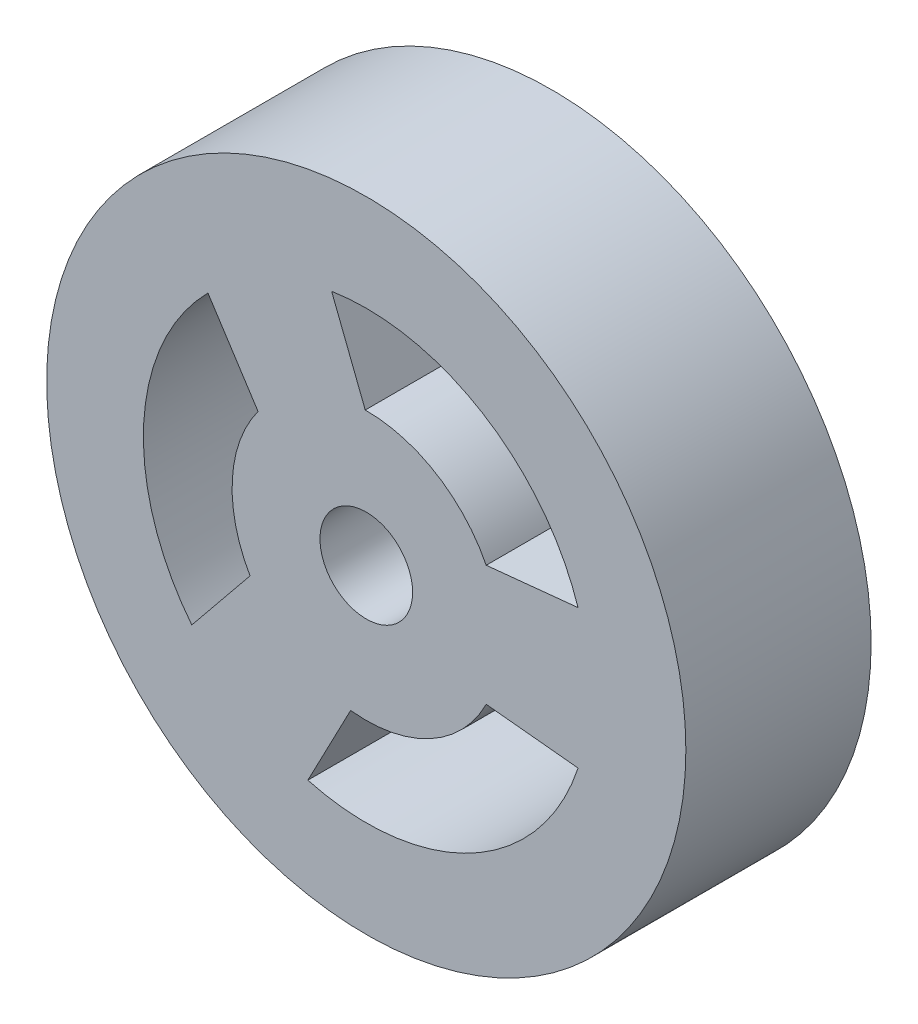
ISO-10303-21;
HEADER;
FILE_DESCRIPTION(('STEP AP214'),'2;1');
FILE_NAME('part.step','',(''),(''),'','','');
FILE_SCHEMA(('AUTOMOTIVE_DESIGN { 1 0 10303 214 1 1 1 1 }'));
ENDSEC;
DATA;
#1=APPLICATION_CONTEXT('core data for automotive mechanical design processes');
#2=APPLICATION_PROTOCOL_DEFINITION('international standard','automotive_design',2000,#1);
#3=PRODUCT_CONTEXT('',#1,'mechanical');
#4=PRODUCT('Part','Part','',(#3));
#5=PRODUCT_RELATED_PRODUCT_CATEGORY('part','',(#4));
#6=PRODUCT_DEFINITION_FORMATION('','',#4);
#7=PRODUCT_DEFINITION_CONTEXT('part definition',#1,'design');
#8=PRODUCT_DEFINITION('design','',#6,#7);
#9=PRODUCT_DEFINITION_SHAPE('','',#8);
#10=(LENGTH_UNIT() NAMED_UNIT(*) SI_UNIT(.MILLI.,.METRE.));
#11=(NAMED_UNIT(*) PLANE_ANGLE_UNIT() SI_UNIT($,.RADIAN.));
#12=(NAMED_UNIT(*) SI_UNIT($,.STERADIAN.) SOLID_ANGLE_UNIT());
#13=UNCERTAINTY_MEASURE_WITH_UNIT(LENGTH_MEASURE(1.E-05),#10,'distance_accuracy_value','');
#14=(GEOMETRIC_REPRESENTATION_CONTEXT(3) GLOBAL_UNCERTAINTY_ASSIGNED_CONTEXT((#13)) GLOBAL_UNIT_ASSIGNED_CONTEXT((#10,
#11,#12)) REPRESENTATION_CONTEXT('',''));
#15=CARTESIAN_POINT('',(0.,0.,0.));
#16=DIRECTION('',(0.,0.,1.));
#17=DIRECTION('',(1.,0.,0.));
#18=AXIS2_PLACEMENT_3D('',#15,#16,#17);
#19=CARTESIAN_POINT('',(255.493849665995,-76.5806122425345,20.));
#20=DIRECTION('',(0.,0.,1.));
#21=DIRECTION('',(1.,0.,0.));
#22=AXIS2_PLACEMENT_3D('',#19,#20,#21);
#23=PLANE('',#22);
#24=DIRECTION('',(0.994953479662545,0.100337297688321,0.));
#25=VECTOR('',#24,1.);
#26=CARTESIAN_POINT('',(278.355317346375,-69.0805641801001,20.));
#27=LINE('',#26,#25);
#28=CARTESIAN_POINT('',(268.439022561395,-70.0805850274498,20.));
#29=VERTEX_POINT('',#28);
#30=CARTESIAN_POINT('',(278.355317346375,-69.0805641801001,20.));
#31=VERTEX_POINT('',#30);
#32=EDGE_CURVE('E153',#29,#31,#27,.T.);
#33=ORIENTED_EDGE('',*,*,#32,.F.);
#34=CARTESIAN_POINT('',(255.493849665995,-76.5806122425345,20.));
#35=DIRECTION('',(0.,0.,-1.));
#36=DIRECTION('',(1.,0.,0.));
#37=AXIS2_PLACEMENT_3D('',#34,#35,#36);
#38=CIRCLE('',#37,14.4854359647257);
#39=CARTESIAN_POINT('',(255.382868285554,-62.0956014306331,20.));
#40=VERTEX_POINT('',#39);
#41=EDGE_CURVE('E136',#40,#29,#38,.T.);
#42=ORIENTED_EDGE('',*,*,#41,.F.);
#43=DIRECTION('',(0.363942528658474,-0.931421406149588,0.));
#44=VECTOR('',#43,1.);
#45=CARTESIAN_POINT('',(251.755601812568,-52.8125048626089,20.));
#46=LINE('',#45,#44);
#47=CARTESIAN_POINT('',(251.755601812558,-52.8125048625829,20.));
#48=VERTEX_POINT('',#47);
#49=EDGE_CURVE('E157',#48,#40,#46,.T.);
#50=ORIENTED_EDGE('',*,*,#49,.F.);
#51=CARTESIAN_POINT('',(255.493849665995,-76.5806122425345,20.));
#52=DIRECTION('',(0.,0.,1.));
#53=DIRECTION('',(1.,0.,0.));
#54=AXIS2_PLACEMENT_3D('',#51,#52,#53);
#55=CIRCLE('',#54,24.0602873099761);
#56=EDGE_CURVE('E155',#31,#48,#55,.T.);
#57=ORIENTED_EDGE('',*,*,#56,.F.);
#58=EDGE_LOOP('',(#33,#42,#50,#57));
#59=FACE_BOUND('',#58,.T.);
#60=DIRECTION('',(0.630869720506526,0.775888777949531,0.));
#61=VECTOR('',#60,1.);
#62=CARTESIAN_POINT('',(242.9468375791,-83.8194203473961,20.));
#63=LINE('',#62,#61);
#64=CARTESIAN_POINT('',(236.659216853789,-91.5523867621652,20.));
#65=VERTEX_POINT('',#64);
#66=CARTESIAN_POINT('',(242.9468375791,-83.8194203473961,20.));
#67=VERTEX_POINT('',#66);
#68=EDGE_CURVE('E207',#65,#67,#63,.T.);
#69=ORIENTED_EDGE('',*,*,#68,.F.);
#70=CARTESIAN_POINT('',(255.493849665995,-76.5806122425345,20.));
#71=DIRECTION('',(0.,0.,1.));
#72=DIRECTION('',(1.,0.,0.));
#73=AXIS2_PLACEMENT_3D('',#70,#71,#72);
#74=CIRCLE('',#73,24.0602873099493);
#75=CARTESIAN_POINT('',(238.402528057833,-59.6459096728496,20.));
#76=VERTEX_POINT('',#75);
#77=EDGE_CURVE('E205',#76,#65,#74,.T.);
#78=ORIENTED_EDGE('',*,*,#77,.F.);
#79=DIRECTION('',(-0.54258031605217,0.840003928938864,0.));
#80=VECTOR('',#79,1.);
#81=CARTESIAN_POINT('',(238.402528057833,-59.6459096728496,20.));
#82=LINE('',#81,#80);
#83=CARTESIAN_POINT('',(243.810204364784,-68.0178855995088,20.));
#84=VERTEX_POINT('',#83);
#85=EDGE_CURVE('E212',#84,#76,#82,.T.);
#86=ORIENTED_EDGE('',*,*,#85,.F.);
#87=CARTESIAN_POINT('',(255.493849665995,-76.5806122425345,20.));
#88=DIRECTION('',(0.,0.,-1.));
#89=DIRECTION('',(1.,0.,0.));
#90=AXIS2_PLACEMENT_3D('',#87,#88,#89);
#91=CIRCLE('',#90,14.4854359647097);
#92=EDGE_CURVE('E209',#67,#84,#91,.T.);
#93=ORIENTED_EDGE('',*,*,#92,.F.);
#94=EDGE_LOOP('',(#69,#78,#86,#93));
#95=FACE_BOUND('',#94,.T.);
#96=CARTESIAN_POINT('',(255.493849665995,-76.5806122425345,20.));
#97=DIRECTION('',(0.,0.,1.));
#98=DIRECTION('',(1.,0.,0.));
#99=AXIS2_PLACEMENT_3D('',#96,#97,#98);
#100=CIRCLE('',#99,34.5);
#101=CARTESIAN_POINT('',(289.993849665995,-76.5806122425345,20.));
#102=VERTEX_POINT('',#101);
#103=EDGE_CURVE('E11',#102,#102,#100,.T.);
#104=ORIENTED_EDGE('',*,*,#103,.T.);
#105=EDGE_LOOP('',(#104));
#106=FACE_BOUND('',#105,.T.);
#107=DIRECTION('',(-0.463255375002821,-0.886224834639041,0.));
#108=VECTOR('',#107,1.);
#109=CARTESIAN_POINT('',(253.805371583113,-90.967303900151,20.));
#110=LINE('',#109,#108);
#111=CARTESIAN_POINT('',(253.805371583113,-90.967303900151,20.));
#112=VERTEX_POINT('',#111);
#113=CARTESIAN_POINT('',(249.188294550725,-99.7999447076506,20.));
#114=VERTEX_POINT('',#113);
#115=EDGE_CURVE('E176',#112,#114,#110,.T.);
#116=ORIENTED_EDGE('',*,*,#115,.F.);
#117=CARTESIAN_POINT('',(255.493849665995,-76.5806122425345,20.));
#118=DIRECTION('',(0.,0.,-1.));
#119=DIRECTION('',(1.,0.,0.));
#120=AXIS2_PLACEMENT_3D('',#117,#118,#119);
#121=CIRCLE('',#120,14.4854359647256);
#122=CARTESIAN_POINT('',(268.439049891716,-83.0805850274497,20.));
#123=VERTEX_POINT('',#122);
#124=EDGE_CURVE('E174',#123,#112,#121,.T.);
#125=ORIENTED_EDGE('',*,*,#124,.F.);
#126=DIRECTION('',(-0.994953901538399,0.100333114242101,0.));
#127=VECTOR('',#126,1.);
#128=CARTESIAN_POINT('',(268.439049891716,-83.0805850274497,20.));
#129=LINE('',#128,#127);
#130=CARTESIAN_POINT('',(278.355348881334,-84.0805641800976,20.));
#131=VERTEX_POINT('',#130);
#132=EDGE_CURVE('E181',#131,#123,#129,.T.);
#133=ORIENTED_EDGE('',*,*,#132,.F.);
#134=CARTESIAN_POINT('',(255.493849665995,-76.5806122425345,20.));
#135=DIRECTION('',(0.,0.,1.));
#136=DIRECTION('',(1.,0.,0.));
#137=AXIS2_PLACEMENT_3D('',#134,#135,#136);
#138=CIRCLE('',#137,24.0602873099759);
#139=EDGE_CURVE('E178',#114,#131,#138,.T.);
#140=ORIENTED_EDGE('',*,*,#139,.F.);
#141=EDGE_LOOP('',(#116,#125,#133,#140));
#142=FACE_BOUND('',#141,.T.);
#143=CARTESIAN_POINT('',(255.493849665995,-76.5806122425345,20.));
#144=DIRECTION('',(0.,0.,1.));
#145=DIRECTION('',(1.,0.,0.));
#146=AXIS2_PLACEMENT_3D('',#143,#144,#145);
#147=CIRCLE('',#146,4.99999999999999);
#148=CARTESIAN_POINT('',(260.493849665995,-76.5806122425345,20.));
#149=VERTEX_POINT('',#148);
#150=EDGE_CURVE('E143',#149,#149,#147,.T.);
#151=ORIENTED_EDGE('',*,*,#150,.F.);
#152=EDGE_LOOP('',(#151));
#153=FACE_BOUND('',#152,.T.);
#154=ADVANCED_FACE('F32',(#59,#95,#106,#142,#153),#23,.T.);
#155=CARTESIAN_POINT('',(255.493849665995,-76.5806122425345,0.));
#156=DIRECTION('',(0.,0.,1.));
#157=DIRECTION('',(1.,0.,0.));
#158=AXIS2_PLACEMENT_3D('',#155,#156,#157);
#159=PLANE('',#158);
#160=CARTESIAN_POINT('',(255.493849665995,-76.5806122425345,0.));
#161=DIRECTION('',(0.,0.,-1.));
#162=DIRECTION('',(1.,0.,0.));
#163=AXIS2_PLACEMENT_3D('',#160,#161,#162);
#164=CIRCLE('',#163,14.4854359647257);
#165=CARTESIAN_POINT('',(255.382868285553,-62.0956014306331,0.));
#166=VERTEX_POINT('',#165);
#167=CARTESIAN_POINT('',(268.439022561395,-70.0805850274498,0.));
#168=VERTEX_POINT('',#167);
#169=EDGE_CURVE('E55',#166,#168,#164,.T.);
#170=ORIENTED_EDGE('',*,*,#169,.T.);
#171=DIRECTION('',(0.994953479662545,0.100337297688321,0.));
#172=VECTOR('',#171,1.);
#173=CARTESIAN_POINT('',(278.355317346375,-69.0805641801001,0.));
#174=LINE('',#173,#172);
#175=CARTESIAN_POINT('',(278.355317346375,-69.0805641801001,0.));
#176=VERTEX_POINT('',#175);
#177=EDGE_CURVE('E123',#168,#176,#174,.T.);
#178=ORIENTED_EDGE('',*,*,#177,.T.);
#179=CARTESIAN_POINT('',(255.493849665995,-76.5806122425345,0.));
#180=DIRECTION('',(0.,0.,1.));
#181=DIRECTION('',(1.,0.,0.));
#182=AXIS2_PLACEMENT_3D('',#179,#180,#181);
#183=CIRCLE('',#182,24.0602873099761);
#184=CARTESIAN_POINT('',(251.755601812564,-52.8125048625829,0.));
#185=VERTEX_POINT('',#184);
#186=EDGE_CURVE('E132',#176,#185,#183,.T.);
#187=ORIENTED_EDGE('',*,*,#186,.T.);
#188=DIRECTION('',(0.363942528658474,-0.931421406149588,0.));
#189=VECTOR('',#188,1.);
#190=CARTESIAN_POINT('',(251.755601812568,-52.8125048626089,0.));
#191=LINE('',#190,#189);
#192=EDGE_CURVE('E142',#185,#166,#191,.T.);
#193=ORIENTED_EDGE('',*,*,#192,.T.);
#194=EDGE_LOOP('',(#170,#178,#187,#193));
#195=FACE_BOUND('',#194,.T.);
#196=CARTESIAN_POINT('',(255.493849665995,-76.5806122425345,0.));
#197=DIRECTION('',(0.,0.,1.));
#198=DIRECTION('',(1.,0.,0.));
#199=AXIS2_PLACEMENT_3D('',#196,#197,#198);
#200=CIRCLE('',#199,24.0602873099493);
#201=CARTESIAN_POINT('',(238.402528057833,-59.6459096728496,0.));
#202=VERTEX_POINT('',#201);
#203=CARTESIAN_POINT('',(236.659216853789,-91.5523867621652,0.));
#204=VERTEX_POINT('',#203);
#205=EDGE_CURVE('E193',#202,#204,#200,.T.);
#206=ORIENTED_EDGE('',*,*,#205,.T.);
#207=DIRECTION('',(0.630869720506526,0.775888777949531,0.));
#208=VECTOR('',#207,1.);
#209=CARTESIAN_POINT('',(242.9468375791,-83.8194203473961,0.));
#210=LINE('',#209,#208);
#211=CARTESIAN_POINT('',(242.9468375791,-83.8194203473961,0.));
#212=VERTEX_POINT('',#211);
#213=EDGE_CURVE('E196',#204,#212,#210,.T.);
#214=ORIENTED_EDGE('',*,*,#213,.T.);
#215=CARTESIAN_POINT('',(255.493849665995,-76.5806122425345,0.));
#216=DIRECTION('',(0.,0.,-1.));
#217=DIRECTION('',(1.,0.,0.));
#218=AXIS2_PLACEMENT_3D('',#215,#216,#217);
#219=CIRCLE('',#218,14.4854359647097);
#220=CARTESIAN_POINT('',(243.810204364784,-68.0178855995088,0.));
#221=VERTEX_POINT('',#220);
#222=EDGE_CURVE('E199',#212,#221,#219,.T.);
#223=ORIENTED_EDGE('',*,*,#222,.T.);
#224=DIRECTION('',(-0.54258031605217,0.840003928938864,0.));
#225=VECTOR('',#224,1.);
#226=CARTESIAN_POINT('',(238.402528057833,-59.6459096728496,0.));
#227=LINE('',#226,#225);
#228=EDGE_CURVE('E202',#221,#202,#227,.T.);
#229=ORIENTED_EDGE('',*,*,#228,.T.);
#230=EDGE_LOOP('',(#206,#214,#223,#229));
#231=FACE_BOUND('',#230,.T.);
#232=CARTESIAN_POINT('',(255.493849665995,-76.5806122425345,0.));
#233=DIRECTION('',(0.,0.,1.));
#234=DIRECTION('',(1.,0.,0.));
#235=AXIS2_PLACEMENT_3D('',#232,#233,#234);
#236=CIRCLE('',#235,34.5);
#237=CARTESIAN_POINT('',(289.993849665995,-76.5806122425345,0.));
#238=VERTEX_POINT('',#237);
#239=EDGE_CURVE('E40',#238,#238,#236,.T.);
#240=ORIENTED_EDGE('',*,*,#239,.F.);
#241=EDGE_LOOP('',(#240));
#242=FACE_BOUND('',#241,.T.);
#243=CARTESIAN_POINT('',(255.493849665995,-76.5806122425345,0.));
#244=DIRECTION('',(0.,0.,-1.));
#245=DIRECTION('',(1.,0.,0.));
#246=AXIS2_PLACEMENT_3D('',#243,#244,#245);
#247=CIRCLE('',#246,14.4854359647256);
#248=CARTESIAN_POINT('',(268.439049891716,-83.0805850274497,0.));
#249=VERTEX_POINT('',#248);
#250=CARTESIAN_POINT('',(253.805371583113,-90.967303900151,0.));
#251=VERTEX_POINT('',#250);
#252=EDGE_CURVE('E137',#249,#251,#247,.T.);
#253=ORIENTED_EDGE('',*,*,#252,.T.);
#254=DIRECTION('',(-0.463255375002821,-0.886224834639041,0.));
#255=VECTOR('',#254,1.);
#256=CARTESIAN_POINT('',(253.805371583113,-90.967303900151,0.));
#257=LINE('',#256,#255);
#258=CARTESIAN_POINT('',(249.188294550725,-99.7999447076505,0.));
#259=VERTEX_POINT('',#258);
#260=EDGE_CURVE('E165',#251,#259,#257,.T.);
#261=ORIENTED_EDGE('',*,*,#260,.T.);
#262=CARTESIAN_POINT('',(255.493849665995,-76.5806122425345,0.));
#263=DIRECTION('',(0.,0.,1.));
#264=DIRECTION('',(1.,0.,0.));
#265=AXIS2_PLACEMENT_3D('',#262,#263,#264);
#266=CIRCLE('',#265,24.0602873099759);
#267=CARTESIAN_POINT('',(278.355348881334,-84.0805641800919,0.));
#268=VERTEX_POINT('',#267);
#269=EDGE_CURVE('E168',#259,#268,#266,.T.);
#270=ORIENTED_EDGE('',*,*,#269,.T.);
#271=DIRECTION('',(-0.994953901538399,0.100333114242101,0.));
#272=VECTOR('',#271,1.);
#273=CARTESIAN_POINT('',(268.439049891716,-83.0805850274497,0.));
#274=LINE('',#273,#272);
#275=EDGE_CURVE('E171',#268,#249,#274,.T.);
#276=ORIENTED_EDGE('',*,*,#275,.T.);
#277=EDGE_LOOP('',(#253,#261,#270,#276));
#278=FACE_BOUND('',#277,.T.);
#279=CARTESIAN_POINT('',(255.493849665995,-76.5806122425345,0.));
#280=DIRECTION('',(0.,0.,1.));
#281=DIRECTION('',(1.,0.,0.));
#282=AXIS2_PLACEMENT_3D('',#279,#280,#281);
#283=CIRCLE('',#282,4.99999999999999);
#284=CARTESIAN_POINT('',(260.493849665995,-76.5806122425345,0.));
#285=VERTEX_POINT('',#284);
#286=EDGE_CURVE('E146',#285,#285,#283,.T.);
#287=ORIENTED_EDGE('',*,*,#286,.T.);
#288=EDGE_LOOP('',(#287));
#289=FACE_BOUND('',#288,.T.);
#290=ADVANCED_FACE('F140',(#195,#231,#242,#278,#289),#159,.F.);
#291=CARTESIAN_POINT('',(255.493849665995,-76.5806122425345,20.));
#292=DIRECTION('',(0.,0.,-1.));
#293=DIRECTION('',(-1.,0.,0.));
#294=AXIS2_PLACEMENT_3D('',#291,#292,#293);
#295=CYLINDRICAL_SURFACE('',#294,34.5);
#296=ORIENTED_EDGE('',*,*,#103,.F.);
#297=EDGE_LOOP('',(#296));
#298=FACE_BOUND('',#297,.T.);
#299=ORIENTED_EDGE('',*,*,#239,.T.);
#300=EDGE_LOOP('',(#299));
#301=FACE_BOUND('',#300,.T.);
#302=ADVANCED_FACE('F34',(#298,#301),#295,.T.);
#303=CARTESIAN_POINT('',(255.493849665995,-76.5806122425345,20.));
#304=DIRECTION('',(0.,0.,-1.));
#305=DIRECTION('',(-1.,0.,0.));
#306=AXIS2_PLACEMENT_3D('',#303,#304,#305);
#307=CYLINDRICAL_SURFACE('',#306,24.0602873099493);
#308=ORIENTED_EDGE('',*,*,#205,.F.);
#309=DIRECTION('',(0.,0.,-1.));
#310=VECTOR('',#309,1.);
#311=CARTESIAN_POINT('',(238.402528057833,-59.6459096728496,20.));
#312=LINE('',#311,#310);
#313=EDGE_CURVE('E214',#76,#202,#312,.T.);
#314=ORIENTED_EDGE('',*,*,#313,.F.);
#315=ORIENTED_EDGE('',*,*,#77,.T.);
#316=DIRECTION('',(0.,0.,-1.));
#317=VECTOR('',#316,1.);
#318=CARTESIAN_POINT('',(236.659216853789,-91.5523867621652,20.));
#319=LINE('',#318,#317);
#320=EDGE_CURVE('E221',#65,#204,#319,.T.);
#321=ORIENTED_EDGE('',*,*,#320,.T.);
#322=EDGE_LOOP('',(#308,#314,#315,#321));
#323=FACE_BOUND('',#322,.T.);
#324=ADVANCED_FACE('F250',(#323),#307,.F.);
#325=CARTESIAN_POINT('',(242.9468375791,-83.8194203473961,20.));
#326=DIRECTION('',(-0.775888777949533,0.630869720506526,0.));
#327=DIRECTION('',(-0.630869720506526,-0.775888777949531,0.));
#328=AXIS2_PLACEMENT_3D('',#325,#326,#327);
#329=PLANE('',#328);
#330=ORIENTED_EDGE('',*,*,#213,.F.);
#331=ORIENTED_EDGE('',*,*,#320,.F.);
#332=ORIENTED_EDGE('',*,*,#68,.T.);
#333=DIRECTION('',(0.,0.,-1.));
#334=VECTOR('',#333,1.);
#335=CARTESIAN_POINT('',(242.9468375791,-83.8194203473961,20.));
#336=LINE('',#335,#334);
#337=EDGE_CURVE('E219',#67,#212,#336,.T.);
#338=ORIENTED_EDGE('',*,*,#337,.T.);
#339=EDGE_LOOP('',(#330,#331,#332,#338));
#340=FACE_BOUND('',#339,.T.);
#341=ADVANCED_FACE('F253',(#340),#329,.T.);
#342=CARTESIAN_POINT('',(255.493849665995,-76.5806122425345,20.));
#343=DIRECTION('',(0.,0.,-1.));
#344=DIRECTION('',(-1.,0.,0.));
#345=AXIS2_PLACEMENT_3D('',#342,#343,#344);
#346=CYLINDRICAL_SURFACE('',#345,14.4854359647097);
#347=ORIENTED_EDGE('',*,*,#222,.F.);
#348=ORIENTED_EDGE('',*,*,#337,.F.);
#349=ORIENTED_EDGE('',*,*,#92,.T.);
#350=DIRECTION('',(0.,0.,-1.));
#351=VECTOR('',#350,1.);
#352=CARTESIAN_POINT('',(243.810204364784,-68.0178855995088,20.));
#353=LINE('',#352,#351);
#354=EDGE_CURVE('E217',#84,#221,#353,.T.);
#355=ORIENTED_EDGE('',*,*,#354,.T.);
#356=EDGE_LOOP('',(#347,#348,#349,#355));
#357=FACE_BOUND('',#356,.T.);
#358=ADVANCED_FACE('F257',(#357),#346,.T.);
#359=CARTESIAN_POINT('',(238.402528057833,-59.6459096728496,20.));
#360=DIRECTION('',(-0.840003928938864,-0.54258031605217,0.));
#361=DIRECTION('',(0.54258031605217,-0.840003928938864,0.));
#362=AXIS2_PLACEMENT_3D('',#359,#360,#361);
#363=PLANE('',#362);
#364=ORIENTED_EDGE('',*,*,#228,.F.);
#365=ORIENTED_EDGE('',*,*,#354,.F.);
#366=ORIENTED_EDGE('',*,*,#85,.T.);
#367=ORIENTED_EDGE('',*,*,#313,.T.);
#368=EDGE_LOOP('',(#364,#365,#366,#367));
#369=FACE_BOUND('',#368,.T.);
#370=ADVANCED_FACE('F261',(#369),#363,.T.);
#371=CARTESIAN_POINT('',(255.493849665995,-76.5806122425345,20.));
#372=DIRECTION('',(0.,0.,-1.));
#373=DIRECTION('',(-1.,0.,0.));
#374=AXIS2_PLACEMENT_3D('',#371,#372,#373);
#375=CYLINDRICAL_SURFACE('',#374,14.4854359647256);
#376=ORIENTED_EDGE('',*,*,#252,.F.);
#377=DIRECTION('',(0.,0.,-1.));
#378=VECTOR('',#377,1.);
#379=CARTESIAN_POINT('',(268.439049891716,-83.0805850274497,20.));
#380=LINE('',#379,#378);
#381=EDGE_CURVE('E183',#123,#249,#380,.T.);
#382=ORIENTED_EDGE('',*,*,#381,.F.);
#383=ORIENTED_EDGE('',*,*,#124,.T.);
#384=DIRECTION('',(0.,0.,-1.));
#385=VECTOR('',#384,1.);
#386=CARTESIAN_POINT('',(253.805371583113,-90.967303900151,20.));
#387=LINE('',#386,#385);
#388=EDGE_CURVE('E190',#112,#251,#387,.T.);
#389=ORIENTED_EDGE('',*,*,#388,.T.);
#390=EDGE_LOOP('',(#376,#382,#383,#389));
#391=FACE_BOUND('',#390,.T.);
#392=ADVANCED_FACE('F265',(#391),#375,.T.);
#393=CARTESIAN_POINT('',(253.805371583113,-90.967303900151,20.));
#394=DIRECTION('',(0.886224834639042,-0.463255375002821,0.));
#395=DIRECTION('',(0.463255375002821,0.886224834639041,0.));
#396=AXIS2_PLACEMENT_3D('',#393,#394,#395);
#397=PLANE('',#396);
#398=ORIENTED_EDGE('',*,*,#260,.F.);
#399=ORIENTED_EDGE('',*,*,#388,.F.);
#400=ORIENTED_EDGE('',*,*,#115,.T.);
#401=DIRECTION('',(0.,0.,-1.));
#402=VECTOR('',#401,1.);
#403=CARTESIAN_POINT('',(249.188294550725,-99.7999447076506,20.));
#404=LINE('',#403,#402);
#405=EDGE_CURVE('E188',#114,#259,#404,.T.);
#406=ORIENTED_EDGE('',*,*,#405,.T.);
#407=EDGE_LOOP('',(#398,#399,#400,#406));
#408=FACE_BOUND('',#407,.T.);
#409=ADVANCED_FACE('F269',(#408),#397,.T.);
#410=CARTESIAN_POINT('',(255.493849665995,-76.5806122425345,20.));
#411=DIRECTION('',(0.,0.,-1.));
#412=DIRECTION('',(-1.,0.,0.));
#413=AXIS2_PLACEMENT_3D('',#410,#411,#412);
#414=CYLINDRICAL_SURFACE('',#413,24.0602873099759);
#415=ORIENTED_EDGE('',*,*,#269,.F.);
#416=ORIENTED_EDGE('',*,*,#405,.F.);
#417=ORIENTED_EDGE('',*,*,#139,.T.);
#418=DIRECTION('',(0.,0.,-1.));
#419=VECTOR('',#418,1.);
#420=CARTESIAN_POINT('',(278.355348881334,-84.0805641800919,20.));
#421=LINE('',#420,#419);
#422=EDGE_CURVE('E186',#131,#268,#421,.T.);
#423=ORIENTED_EDGE('',*,*,#422,.T.);
#424=EDGE_LOOP('',(#415,#416,#417,#423));
#425=FACE_BOUND('',#424,.T.);
#426=ADVANCED_FACE('F273',(#425),#414,.F.);
#427=CARTESIAN_POINT('',(268.439049891716,-83.0805850274497,20.));
#428=DIRECTION('',(-0.100333114242101,-0.994953901538398,0.));
#429=DIRECTION('',(0.994953901538399,-0.100333114242102,0.));
#430=AXIS2_PLACEMENT_3D('',#427,#428,#429);
#431=PLANE('',#430);
#432=ORIENTED_EDGE('',*,*,#275,.F.);
#433=ORIENTED_EDGE('',*,*,#422,.F.);
#434=ORIENTED_EDGE('',*,*,#132,.T.);
#435=ORIENTED_EDGE('',*,*,#381,.T.);
#436=EDGE_LOOP('',(#432,#433,#434,#435));
#437=FACE_BOUND('',#436,.T.);
#438=ADVANCED_FACE('F277',(#437),#431,.T.);
#439=CARTESIAN_POINT('',(255.493849665995,-76.5806122425345,20.));
#440=DIRECTION('',(0.,0.,-1.));
#441=DIRECTION('',(-1.,0.,0.));
#442=AXIS2_PLACEMENT_3D('',#439,#440,#441);
#443=CYLINDRICAL_SURFACE('',#442,14.4854359647257);
#444=ORIENTED_EDGE('',*,*,#169,.F.);
#445=DIRECTION('',(0.,0.,-1.));
#446=VECTOR('',#445,1.);
#447=CARTESIAN_POINT('',(255.382868285554,-62.0956014306331,20.));
#448=LINE('',#447,#446);
#449=EDGE_CURVE('E159',#40,#166,#448,.T.);
#450=ORIENTED_EDGE('',*,*,#449,.F.);
#451=ORIENTED_EDGE('',*,*,#41,.T.);
#452=DIRECTION('',(0.,0.,-1.));
#453=VECTOR('',#452,1.);
#454=CARTESIAN_POINT('',(268.439022561395,-70.0805850274498,20.));
#455=LINE('',#454,#453);
#456=EDGE_CURVE('E125',#29,#168,#455,.T.);
#457=ORIENTED_EDGE('',*,*,#456,.T.);
#458=EDGE_LOOP('',(#444,#450,#451,#457));
#459=FACE_BOUND('',#458,.T.);
#460=ADVANCED_FACE('F134',(#459),#443,.T.);
#461=CARTESIAN_POINT('',(278.355317346375,-69.0805641801001,20.));
#462=DIRECTION('',(-0.100337297688321,0.994953479662544,0.));
#463=DIRECTION('',(-0.994953479662545,-0.100337297688321,0.));
#464=AXIS2_PLACEMENT_3D('',#461,#462,#463);
#465=PLANE('',#464);
#466=ORIENTED_EDGE('',*,*,#177,.F.);
#467=ORIENTED_EDGE('',*,*,#456,.F.);
#468=ORIENTED_EDGE('',*,*,#32,.T.);
#469=DIRECTION('',(0.,0.,-1.));
#470=VECTOR('',#469,1.);
#471=CARTESIAN_POINT('',(278.355317346375,-69.0805641801001,20.));
#472=LINE('',#471,#470);
#473=EDGE_CURVE('E128',#31,#176,#472,.T.);
#474=ORIENTED_EDGE('',*,*,#473,.T.);
#475=EDGE_LOOP('',(#466,#467,#468,#474));
#476=FACE_BOUND('',#475,.T.);
#477=ADVANCED_FACE('F124',(#476),#465,.T.);
#478=CARTESIAN_POINT('',(255.493849665995,-76.5806122425345,20.));
#479=DIRECTION('',(0.,0.,-1.));
#480=DIRECTION('',(-1.,0.,0.));
#481=AXIS2_PLACEMENT_3D('',#478,#479,#480);
#482=CYLINDRICAL_SURFACE('',#481,24.0602873099761);
#483=ORIENTED_EDGE('',*,*,#186,.F.);
#484=ORIENTED_EDGE('',*,*,#473,.F.);
#485=ORIENTED_EDGE('',*,*,#56,.T.);
#486=DIRECTION('',(0.,0.,-1.));
#487=VECTOR('',#486,1.);
#488=CARTESIAN_POINT('',(251.755601812564,-52.8125048625829,20.));
#489=LINE('',#488,#487);
#490=EDGE_CURVE('E47',#48,#185,#489,.T.);
#491=ORIENTED_EDGE('',*,*,#490,.T.);
#492=EDGE_LOOP('',(#483,#484,#485,#491));
#493=FACE_BOUND('',#492,.T.);
#494=ADVANCED_FACE('F242',(#493),#482,.F.);
#495=CARTESIAN_POINT('',(251.755601812568,-52.8125048626089,20.));
#496=DIRECTION('',(0.931421406149589,0.363942528658473,0.));
#497=DIRECTION('',(-0.363942528658474,0.931421406149588,0.));
#498=AXIS2_PLACEMENT_3D('',#495,#496,#497);
#499=PLANE('',#498);
#500=ORIENTED_EDGE('',*,*,#192,.F.);
#501=ORIENTED_EDGE('',*,*,#490,.F.);
#502=ORIENTED_EDGE('',*,*,#49,.T.);
#503=ORIENTED_EDGE('',*,*,#449,.T.);
#504=EDGE_LOOP('',(#500,#501,#502,#503));
#505=FACE_BOUND('',#504,.T.);
#506=ADVANCED_FACE('F236',(#505),#499,.T.);
#507=CARTESIAN_POINT('',(255.493849665995,-76.5806122425345,20.));
#508=DIRECTION('',(0.,0.,-1.));
#509=DIRECTION('',(-1.,0.,0.));
#510=AXIS2_PLACEMENT_3D('',#507,#508,#509);
#511=CYLINDRICAL_SURFACE('',#510,4.99999999999999);
#512=ORIENTED_EDGE('',*,*,#150,.T.);
#513=EDGE_LOOP('',(#512));
#514=FACE_BOUND('',#513,.T.);
#515=ORIENTED_EDGE('',*,*,#286,.F.);
#516=EDGE_LOOP('',(#515));
#517=FACE_BOUND('',#516,.T.);
#518=ADVANCED_FACE('F234',(#514,#517),#511,.F.);
#519=CLOSED_SHELL('',(#154,#290,#302,#324,#341,#358,#370,#392,#409,#426,#438,#460,#477,#494,
#506,#518));
#520=MANIFOLD_SOLID_BREP('B2',#519);
#521=ADVANCED_BREP_SHAPE_REPRESENTATION('',(#18,#520),#14);
#522=SHAPE_DEFINITION_REPRESENTATION(#9,#521);
ENDSEC;
END-ISO-10303-21;
